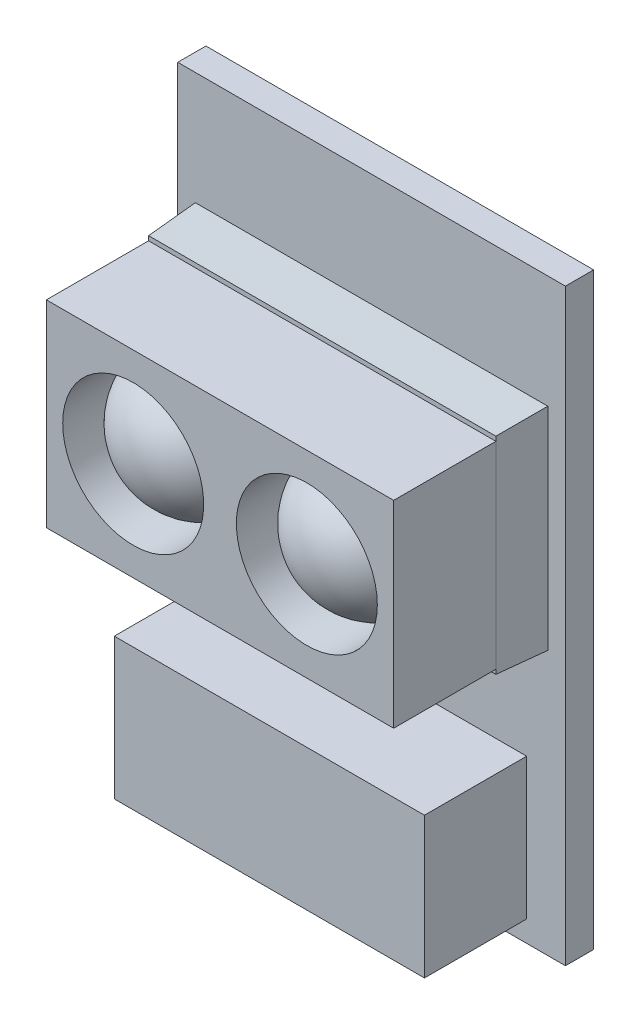
ISO-10303-21;
HEADER;
FILE_DESCRIPTION(('STEP AP214'),'2;1');
FILE_NAME('part.step','',(''),(''),'','','');
FILE_SCHEMA(('AUTOMOTIVE_DESIGN { 1 0 10303 214 1 1 1 1 }'));
ENDSEC;
DATA;
#1=APPLICATION_CONTEXT('core data for automotive mechanical design processes');
#2=APPLICATION_PROTOCOL_DEFINITION('international standard','automotive_design',2000,#1);
#3=PRODUCT_CONTEXT('',#1,'mechanical');
#4=PRODUCT('Part','Part','',(#3));
#5=PRODUCT_RELATED_PRODUCT_CATEGORY('part','',(#4));
#6=PRODUCT_DEFINITION_FORMATION('','',#4);
#7=PRODUCT_DEFINITION_CONTEXT('part definition',#1,'design');
#8=PRODUCT_DEFINITION('design','',#6,#7);
#9=PRODUCT_DEFINITION_SHAPE('','',#8);
#10=(LENGTH_UNIT() NAMED_UNIT(*) SI_UNIT(.MILLI.,.METRE.));
#11=(NAMED_UNIT(*) PLANE_ANGLE_UNIT() SI_UNIT($,.RADIAN.));
#12=(NAMED_UNIT(*) SI_UNIT($,.STERADIAN.) SOLID_ANGLE_UNIT());
#13=UNCERTAINTY_MEASURE_WITH_UNIT(LENGTH_MEASURE(1.E-05),#10,'distance_accuracy_value','');
#14=(GEOMETRIC_REPRESENTATION_CONTEXT(3) GLOBAL_UNCERTAINTY_ASSIGNED_CONTEXT((#13)) GLOBAL_UNIT_ASSIGNED_CONTEXT((#10,
#11,#12)) REPRESENTATION_CONTEXT('',''));
#15=CARTESIAN_POINT('',(0.,0.,0.));
#16=DIRECTION('',(0.,0.,1.));
#17=DIRECTION('',(1.,0.,0.));
#18=AXIS2_PLACEMENT_3D('',#15,#16,#17);
#19=CARTESIAN_POINT('',(4.4,-7.75,3.7));
#20=DIRECTION('',(0.,1.,0.));
#21=DIRECTION('',(0.,0.,1.));
#22=AXIS2_PLACEMENT_3D('',#19,#20,#21);
#23=PLANE('',#22);
#24=DIRECTION('',(1.,0.,0.));
#25=VECTOR('',#24,1.);
#26=CARTESIAN_POINT('',(4.4,-7.75,0.8));
#27=LINE('',#26,#25);
#28=CARTESIAN_POINT('',(-4.4,-7.75,0.8));
#29=VERTEX_POINT('',#28);
#30=CARTESIAN_POINT('',(4.4,-7.75,0.8));
#31=VERTEX_POINT('',#30);
#32=EDGE_CURVE('E169',#29,#31,#27,.T.);
#33=ORIENTED_EDGE('',*,*,#32,.T.);
#34=DIRECTION('',(0.,0.,-1.));
#35=VECTOR('',#34,1.);
#36=CARTESIAN_POINT('',(4.4,-7.75,3.7));
#37=LINE('',#36,#35);
#38=CARTESIAN_POINT('',(4.4,-7.75,3.7));
#39=VERTEX_POINT('',#38);
#40=EDGE_CURVE('E54',#39,#31,#37,.T.);
#41=ORIENTED_EDGE('',*,*,#40,.F.);
#42=DIRECTION('',(1.,0.,0.));
#43=VECTOR('',#42,1.);
#44=CARTESIAN_POINT('',(4.4,-7.75,3.7));
#45=LINE('',#44,#43);
#46=CARTESIAN_POINT('',(-4.4,-7.75,3.7));
#47=VERTEX_POINT('',#46);
#48=EDGE_CURVE('E98',#47,#39,#45,.T.);
#49=ORIENTED_EDGE('',*,*,#48,.F.);
#50=DIRECTION('',(0.,0.,-1.));
#51=VECTOR('',#50,1.);
#52=CARTESIAN_POINT('',(-4.4,-7.75,3.7));
#53=LINE('',#52,#51);
#54=EDGE_CURVE('E12',#47,#29,#53,.T.);
#55=ORIENTED_EDGE('',*,*,#54,.T.);
#56=EDGE_LOOP('',(#33,#41,#49,#55));
#57=FACE_BOUND('',#56,.T.);
#58=DIRECTION('',(1.,0.,0.));
#59=VECTOR('',#58,1.);
#60=CARTESIAN_POINT('',(4.4,-7.75,1.));
#61=LINE('',#60,#59);
#62=CARTESIAN_POINT('',(-4.2,-7.75,1.));
#63=VERTEX_POINT('',#62);
#64=CARTESIAN_POINT('',(4.2,-7.75,1.));
#65=VERTEX_POINT('',#64);
#66=EDGE_CURVE('E142',#63,#65,#61,.T.);
#67=ORIENTED_EDGE('',*,*,#66,.F.);
#68=DIRECTION('',(0.,0.,-1.));
#69=VECTOR('',#68,1.);
#70=CARTESIAN_POINT('',(-4.2,-7.75,3.7));
#71=LINE('',#70,#69);
#72=CARTESIAN_POINT('',(-4.2,-7.75,3.5));
#73=VERTEX_POINT('',#72);
#74=EDGE_CURVE('E141',#73,#63,#71,.T.);
#75=ORIENTED_EDGE('',*,*,#74,.F.);
#76=DIRECTION('',(1.,0.,0.));
#77=VECTOR('',#76,1.);
#78=CARTESIAN_POINT('',(4.4,-7.75,3.5));
#79=LINE('',#78,#77);
#80=CARTESIAN_POINT('',(4.2,-7.75,3.5));
#81=VERTEX_POINT('',#80);
#82=EDGE_CURVE('E146',#73,#81,#79,.T.);
#83=ORIENTED_EDGE('',*,*,#82,.T.);
#84=DIRECTION('',(0.,0.,-1.));
#85=VECTOR('',#84,1.);
#86=CARTESIAN_POINT('',(4.2,-7.75,3.7));
#87=LINE('',#86,#85);
#88=EDGE_CURVE('E151',#81,#65,#87,.T.);
#89=ORIENTED_EDGE('',*,*,#88,.T.);
#90=EDGE_LOOP('',(#67,#75,#83,#89));
#91=FACE_BOUND('',#90,.T.);
#92=ADVANCED_FACE('F46',(#57,#91),#23,.F.);
#93=CARTESIAN_POINT('',(-4.4,-7.75,3.7));
#94=DIRECTION('',(1.,0.,0.));
#95=DIRECTION('',(0.,1.,0.));
#96=AXIS2_PLACEMENT_3D('',#93,#94,#95);
#97=PLANE('',#96);
#98=DIRECTION('',(0.,-1.,0.));
#99=VECTOR('',#98,1.);
#100=CARTESIAN_POINT('',(-4.4,-7.75,0.8));
#101=LINE('',#100,#99);
#102=CARTESIAN_POINT('',(-4.4,-3.75,0.8));
#103=VERTEX_POINT('',#102);
#104=EDGE_CURVE('E154',#103,#29,#101,.T.);
#105=ORIENTED_EDGE('',*,*,#104,.T.);
#106=ORIENTED_EDGE('',*,*,#54,.F.);
#107=DIRECTION('',(0.,-1.,0.));
#108=VECTOR('',#107,1.);
#109=CARTESIAN_POINT('',(-4.4,-7.75,3.7));
#110=LINE('',#109,#108);
#111=CARTESIAN_POINT('',(-4.4,-3.75,3.7));
#112=VERTEX_POINT('',#111);
#113=EDGE_CURVE('E160',#112,#47,#110,.T.);
#114=ORIENTED_EDGE('',*,*,#113,.F.);
#115=DIRECTION('',(0.,0.,-1.));
#116=VECTOR('',#115,1.);
#117=CARTESIAN_POINT('',(-4.4,-3.75,3.7));
#118=LINE('',#117,#116);
#119=EDGE_CURVE('E166',#112,#103,#118,.T.);
#120=ORIENTED_EDGE('',*,*,#119,.T.);
#121=EDGE_LOOP('',(#105,#106,#114,#120));
#122=FACE_BOUND('',#121,.T.);
#123=ADVANCED_FACE('F48',(#122),#97,.F.);
#124=CARTESIAN_POINT('',(4.4,-7.75,3.7));
#125=DIRECTION('',(-1.,0.,0.));
#126=DIRECTION('',(0.,0.,1.));
#127=AXIS2_PLACEMENT_3D('',#124,#125,#126);
#128=PLANE('',#127);
#129=DIRECTION('',(0.,1.,0.));
#130=VECTOR('',#129,1.);
#131=CARTESIAN_POINT('',(4.4,-7.75,0.8));
#132=LINE('',#131,#130);
#133=CARTESIAN_POINT('',(4.4,-3.75,0.8));
#134=VERTEX_POINT('',#133);
#135=EDGE_CURVE('E171',#31,#134,#132,.T.);
#136=ORIENTED_EDGE('',*,*,#135,.T.);
#137=DIRECTION('',(0.,0.,-1.));
#138=VECTOR('',#137,1.);
#139=CARTESIAN_POINT('',(4.4,-3.75,3.7));
#140=LINE('',#139,#138);
#141=CARTESIAN_POINT('',(4.4,-3.75,3.7));
#142=VERTEX_POINT('',#141);
#143=EDGE_CURVE('E175',#142,#134,#140,.T.);
#144=ORIENTED_EDGE('',*,*,#143,.F.);
#145=DIRECTION('',(0.,1.,0.));
#146=VECTOR('',#145,1.);
#147=CARTESIAN_POINT('',(4.4,-7.75,3.7));
#148=LINE('',#147,#146);
#149=EDGE_CURVE('E163',#39,#142,#148,.T.);
#150=ORIENTED_EDGE('',*,*,#149,.F.);
#151=ORIENTED_EDGE('',*,*,#40,.T.);
#152=EDGE_LOOP('',(#136,#144,#150,#151));
#153=FACE_BOUND('',#152,.T.);
#154=ADVANCED_FACE('F180',(#153),#128,.F.);
#155=CARTESIAN_POINT('',(4.4,-3.75,3.7));
#156=DIRECTION('',(0.,-1.,0.));
#157=DIRECTION('',(0.,0.,-1.));
#158=AXIS2_PLACEMENT_3D('',#155,#156,#157);
#159=PLANE('',#158);
#160=DIRECTION('',(-1.,0.,0.));
#161=VECTOR('',#160,1.);
#162=CARTESIAN_POINT('',(4.4,-3.75,0.8));
#163=LINE('',#162,#161);
#164=EDGE_CURVE('E91',#134,#103,#163,.T.);
#165=ORIENTED_EDGE('',*,*,#164,.T.);
#166=ORIENTED_EDGE('',*,*,#119,.F.);
#167=DIRECTION('',(-1.,0.,0.));
#168=VECTOR('',#167,1.);
#169=CARTESIAN_POINT('',(4.4,-3.75,3.7));
#170=LINE('',#169,#168);
#171=EDGE_CURVE('E70',#142,#112,#170,.T.);
#172=ORIENTED_EDGE('',*,*,#171,.F.);
#173=ORIENTED_EDGE('',*,*,#143,.T.);
#174=EDGE_LOOP('',(#165,#166,#172,#173));
#175=FACE_BOUND('',#174,.T.);
#176=ADVANCED_FACE('F188',(#175),#159,.F.);
#177=CARTESIAN_POINT('',(0.,0.,3.7));
#178=DIRECTION('',(0.,0.,1.));
#179=DIRECTION('',(1.,0.,0.));
#180=AXIS2_PLACEMENT_3D('',#177,#178,#179);
#181=PLANE('',#180);
#182=ORIENTED_EDGE('',*,*,#113,.T.);
#183=ORIENTED_EDGE('',*,*,#48,.T.);
#184=ORIENTED_EDGE('',*,*,#149,.T.);
#185=ORIENTED_EDGE('',*,*,#171,.T.);
#186=EDGE_LOOP('',(#182,#183,#184,#185));
#187=FACE_BOUND('',#186,.T.);
#188=ADVANCED_FACE('F190',(#187),#181,.T.);
#189=CARTESIAN_POINT('',(0.,0.,0.8));
#190=DIRECTION('',(0.,0.,1.));
#191=DIRECTION('',(1.,0.,0.));
#192=AXIS2_PLACEMENT_3D('',#189,#190,#191);
#193=PLANE('',#192);
#194=ORIENTED_EDGE('',*,*,#104,.F.);
#195=ORIENTED_EDGE('',*,*,#164,.F.);
#196=ORIENTED_EDGE('',*,*,#135,.F.);
#197=ORIENTED_EDGE('',*,*,#32,.F.);
#198=EDGE_LOOP('',(#194,#195,#196,#197));
#199=FACE_BOUND('',#198,.T.);
#200=ADVANCED_FACE('F184',(#199),#193,.F.);
#201=CARTESIAN_POINT('',(-4.2,-7.75,3.7));
#202=DIRECTION('',(1.,0.,0.));
#203=DIRECTION('',(0.,1.,0.));
#204=AXIS2_PLACEMENT_3D('',#201,#202,#203);
#205=PLANE('',#204);
#206=DIRECTION('',(0.,-1.,0.));
#207=VECTOR('',#206,1.);
#208=CARTESIAN_POINT('',(-4.2,-7.75,1.));
#209=LINE('',#208,#207);
#210=CARTESIAN_POINT('',(-4.2,-3.95,1.));
#211=VERTEX_POINT('',#210);
#212=EDGE_CURVE('E125',#211,#63,#209,.T.);
#213=ORIENTED_EDGE('',*,*,#212,.F.);
#214=DIRECTION('',(0.,0.,-1.));
#215=VECTOR('',#214,1.);
#216=CARTESIAN_POINT('',(-4.2,-3.95,3.7));
#217=LINE('',#216,#215);
#218=CARTESIAN_POINT('',(-4.2,-3.95,3.5));
#219=VERTEX_POINT('',#218);
#220=EDGE_CURVE('E133',#219,#211,#217,.T.);
#221=ORIENTED_EDGE('',*,*,#220,.F.);
#222=DIRECTION('',(0.,-1.,0.));
#223=VECTOR('',#222,1.);
#224=CARTESIAN_POINT('',(-4.2,-7.75,3.5));
#225=LINE('',#224,#223);
#226=EDGE_CURVE('E61',#219,#73,#225,.T.);
#227=ORIENTED_EDGE('',*,*,#226,.T.);
#228=ORIENTED_EDGE('',*,*,#74,.T.);
#229=EDGE_LOOP('',(#213,#221,#227,#228));
#230=FACE_BOUND('',#229,.T.);
#231=ADVANCED_FACE('F139',(#230),#205,.T.);
#232=CARTESIAN_POINT('',(4.2,-7.75,3.7));
#233=DIRECTION('',(-1.,0.,0.));
#234=DIRECTION('',(0.,0.,1.));
#235=AXIS2_PLACEMENT_3D('',#232,#233,#234);
#236=PLANE('',#235);
#237=DIRECTION('',(0.,1.,0.));
#238=VECTOR('',#237,1.);
#239=CARTESIAN_POINT('',(4.2,-7.75,1.));
#240=LINE('',#239,#238);
#241=CARTESIAN_POINT('',(4.2,-3.95,1.));
#242=VERTEX_POINT('',#241);
#243=EDGE_CURVE('E128',#65,#242,#240,.T.);
#244=ORIENTED_EDGE('',*,*,#243,.F.);
#245=ORIENTED_EDGE('',*,*,#88,.F.);
#246=DIRECTION('',(0.,1.,0.));
#247=VECTOR('',#246,1.);
#248=CARTESIAN_POINT('',(4.2,-7.75,3.5));
#249=LINE('',#248,#247);
#250=CARTESIAN_POINT('',(4.2,-3.95,3.5));
#251=VERTEX_POINT('',#250);
#252=EDGE_CURVE('E149',#81,#251,#249,.T.);
#253=ORIENTED_EDGE('',*,*,#252,.T.);
#254=DIRECTION('',(0.,0.,-1.));
#255=VECTOR('',#254,1.);
#256=CARTESIAN_POINT('',(4.2,-3.95,3.7));
#257=LINE('',#256,#255);
#258=EDGE_CURVE('E137',#251,#242,#257,.T.);
#259=ORIENTED_EDGE('',*,*,#258,.T.);
#260=EDGE_LOOP('',(#244,#245,#253,#259));
#261=FACE_BOUND('',#260,.T.);
#262=ADVANCED_FACE('F205',(#261),#236,.T.);
#263=CARTESIAN_POINT('',(4.4,-3.95,3.7));
#264=DIRECTION('',(0.,-1.,0.));
#265=DIRECTION('',(0.,0.,-1.));
#266=AXIS2_PLACEMENT_3D('',#263,#264,#265);
#267=PLANE('',#266);
#268=DIRECTION('',(-1.,0.,0.));
#269=VECTOR('',#268,1.);
#270=CARTESIAN_POINT('',(4.4,-3.95,1.));
#271=LINE('',#270,#269);
#272=EDGE_CURVE('E121',#242,#211,#271,.T.);
#273=ORIENTED_EDGE('',*,*,#272,.F.);
#274=ORIENTED_EDGE('',*,*,#258,.F.);
#275=DIRECTION('',(-1.,0.,0.));
#276=VECTOR('',#275,1.);
#277=CARTESIAN_POINT('',(4.4,-3.95,3.5));
#278=LINE('',#277,#276);
#279=EDGE_CURVE('E136',#251,#219,#278,.T.);
#280=ORIENTED_EDGE('',*,*,#279,.T.);
#281=ORIENTED_EDGE('',*,*,#220,.T.);
#282=EDGE_LOOP('',(#273,#274,#280,#281));
#283=FACE_BOUND('',#282,.T.);
#284=ADVANCED_FACE('F134',(#283),#267,.T.);
#285=CARTESIAN_POINT('',(0.,0.,3.5));
#286=DIRECTION('',(0.,0.,1.));
#287=DIRECTION('',(1.,0.,0.));
#288=AXIS2_PLACEMENT_3D('',#285,#286,#287);
#289=PLANE('',#288);
#290=ORIENTED_EDGE('',*,*,#226,.F.);
#291=ORIENTED_EDGE('',*,*,#279,.F.);
#292=ORIENTED_EDGE('',*,*,#252,.F.);
#293=ORIENTED_EDGE('',*,*,#82,.F.);
#294=EDGE_LOOP('',(#290,#291,#292,#293));
#295=FACE_BOUND('',#294,.T.);
#296=ADVANCED_FACE('F208',(#295),#289,.F.);
#297=CARTESIAN_POINT('',(0.,0.,1.));
#298=DIRECTION('',(0.,0.,1.));
#299=DIRECTION('',(1.,0.,0.));
#300=AXIS2_PLACEMENT_3D('',#297,#298,#299);
#301=PLANE('',#300);
#302=ORIENTED_EDGE('',*,*,#212,.T.);
#303=ORIENTED_EDGE('',*,*,#66,.T.);
#304=ORIENTED_EDGE('',*,*,#243,.T.);
#305=ORIENTED_EDGE('',*,*,#272,.T.);
#306=EDGE_LOOP('',(#302,#303,#304,#305));
#307=FACE_BOUND('',#306,.T.);
#308=ADVANCED_FACE('F123',(#307),#301,.T.);
#309=CLOSED_SHELL('',(#92,#123,#154,#176,#188,#200,#231,#262,#284,#296,#308));
#310=MANIFOLD_SOLID_BREP('B2',#309);
#311=CARTESIAN_POINT('',(0.,0.,5.1));
#312=DIRECTION('',(0.,0.,-1.));
#313=DIRECTION('',(-1.,0.,0.));
#314=AXIS2_PLACEMENT_3D('',#311,#312,#313);
#315=PLANE('',#314);
#316=CARTESIAN_POINT('',(2.46331455450187,2.15,5.1));
#317=DIRECTION('',(0.,0.,1.));
#318=DIRECTION('',(1.,0.,0.));
#319=AXIS2_PLACEMENT_3D('',#316,#317,#318);
#320=CIRCLE('',#319,2.);
#321=CARTESIAN_POINT('',(4.46331455450187,2.15,5.1));
#322=VERTEX_POINT('',#321);
#323=EDGE_CURVE('E464',#322,#322,#320,.T.);
#324=ORIENTED_EDGE('',*,*,#323,.F.);
#325=EDGE_LOOP('',(#324));
#326=FACE_BOUND('',#325,.T.);
#327=DIRECTION('',(0.,1.,0.));
#328=VECTOR('',#327,1.);
#329=CARTESIAN_POINT('',(4.92662910900374,-0.65,5.1));
#330=LINE('',#329,#328);
#331=CARTESIAN_POINT('',(4.92662910900374,-0.65,5.1));
#332=VERTEX_POINT('',#331);
#333=CARTESIAN_POINT('',(4.92662910900374,4.95,5.1));
#334=VERTEX_POINT('',#333);
#335=EDGE_CURVE('E386',#332,#334,#330,.T.);
#336=ORIENTED_EDGE('',*,*,#335,.T.);
#337=DIRECTION('',(-1.,0.,0.));
#338=VECTOR('',#337,1.);
#339=CARTESIAN_POINT('',(-4.92662910900374,4.95,5.1));
#340=LINE('',#339,#338);
#341=CARTESIAN_POINT('',(-4.92662910900374,4.95,5.1));
#342=VERTEX_POINT('',#341);
#343=EDGE_CURVE('E376',#334,#342,#340,.T.);
#344=ORIENTED_EDGE('',*,*,#343,.T.);
#345=DIRECTION('',(0.,-1.,0.));
#346=VECTOR('',#345,1.);
#347=CARTESIAN_POINT('',(-4.92662910900374,-0.65,5.1));
#348=LINE('',#347,#346);
#349=CARTESIAN_POINT('',(-4.92662910900374,-0.65,5.1));
#350=VERTEX_POINT('',#349);
#351=EDGE_CURVE('E385',#342,#350,#348,.T.);
#352=ORIENTED_EDGE('',*,*,#351,.T.);
#353=DIRECTION('',(1.,0.,0.));
#354=VECTOR('',#353,1.);
#355=CARTESIAN_POINT('',(-4.92662910900374,-0.65,5.1));
#356=LINE('',#355,#354);
#357=EDGE_CURVE('E391',#350,#332,#356,.T.);
#358=ORIENTED_EDGE('',*,*,#357,.T.);
#359=EDGE_LOOP('',(#336,#344,#352,#358));
#360=FACE_BOUND('',#359,.T.);
#361=CARTESIAN_POINT('',(-2.46331455450187,2.15,5.1));
#362=DIRECTION('',(0.,0.,-1.));
#363=DIRECTION('',(-1.,0.,0.));
#364=AXIS2_PLACEMENT_3D('',#361,#362,#363);
#365=CIRCLE('',#364,2.);
#366=CARTESIAN_POINT('',(-4.46331455450187,2.15,5.1));
#367=VERTEX_POINT('',#366);
#368=EDGE_CURVE('E468',#367,#367,#365,.T.);
#369=ORIENTED_EDGE('',*,*,#368,.T.);
#370=EDGE_LOOP('',(#369));
#371=FACE_BOUND('',#370,.T.);
#372=ADVANCED_FACE('F284',(#326,#360,#371),#315,.F.);
#373=CARTESIAN_POINT('',(0.,0.,2.2));
#374=DIRECTION('',(0.,0.,1.));
#375=DIRECTION('',(1.,0.,0.));
#376=AXIS2_PLACEMENT_3D('',#373,#374,#375);
#377=PLANE('',#376);
#378=DIRECTION('',(1.,0.,0.));
#379=VECTOR('',#378,1.);
#380=CARTESIAN_POINT('',(-4.92662910900374,-0.65,2.2));
#381=LINE('',#380,#379);
#382=CARTESIAN_POINT('',(-4.92662910900374,-0.65,2.2));
#383=VERTEX_POINT('',#382);
#384=CARTESIAN_POINT('',(4.92662910900374,-0.65,2.2));
#385=VERTEX_POINT('',#384);
#386=EDGE_CURVE('E395',#383,#385,#381,.T.);
#387=ORIENTED_EDGE('',*,*,#386,.F.);
#388=DIRECTION('',(0.,1.,0.));
#389=VECTOR('',#388,1.);
#390=CARTESIAN_POINT('',(-4.92662910900374,-0.850000000000001,2.2));
#391=LINE('',#390,#389);
#392=CARTESIAN_POINT('',(-4.92662910900374,-0.776629109003743,2.2));
#393=VERTEX_POINT('',#392);
#394=EDGE_CURVE('E415',#383,#393,#391,.F.);
#395=ORIENTED_EDGE('',*,*,#394,.T.);
#396=DIRECTION('',(-1.,0.,0.));
#397=VECTOR('',#396,1.);
#398=CARTESIAN_POINT('',(5.,-0.776629109003742,2.2));
#399=LINE('',#398,#397);
#400=CARTESIAN_POINT('',(4.92662910900374,-0.776629109003742,2.2));
#401=VERTEX_POINT('',#400);
#402=EDGE_CURVE('E432',#393,#401,#399,.F.);
#403=ORIENTED_EDGE('',*,*,#402,.T.);
#404=DIRECTION('',(0.,-1.,0.));
#405=VECTOR('',#404,1.);
#406=CARTESIAN_POINT('',(4.92662910900374,-0.85,2.2));
#407=LINE('',#406,#405);
#408=EDGE_CURVE('E435',#401,#385,#407,.F.);
#409=ORIENTED_EDGE('',*,*,#408,.T.);
#410=EDGE_LOOP('',(#387,#395,#403,#409));
#411=FACE_BOUND('',#410,.T.);
#412=ADVANCED_FACE('F499',(#411),#377,.T.);
#413=CARTESIAN_POINT('',(0.,0.,0.8));
#414=DIRECTION('',(0.,0.,-1.));
#415=DIRECTION('',(-1.,0.,0.));
#416=AXIS2_PLACEMENT_3D('',#413,#414,#415);
#417=PLANE('',#416);
#418=DIRECTION('',(0.,1.,0.));
#419=VECTOR('',#418,1.);
#420=CARTESIAN_POINT('',(5.5,-8.35,0.8));
#421=LINE('',#420,#419);
#422=CARTESIAN_POINT('',(5.5,-8.35,0.8));
#423=VERTEX_POINT('',#422);
#424=CARTESIAN_POINT('',(5.5,8.35,0.8));
#425=VERTEX_POINT('',#424);
#426=EDGE_CURVE('E438',#423,#425,#421,.T.);
#427=ORIENTED_EDGE('',*,*,#426,.T.);
#428=DIRECTION('',(-1.,0.,0.));
#429=VECTOR('',#428,1.);
#430=CARTESIAN_POINT('',(-5.5,8.35,0.8));
#431=LINE('',#430,#429);
#432=CARTESIAN_POINT('',(-5.5,8.35,0.8));
#433=VERTEX_POINT('',#432);
#434=EDGE_CURVE('E441',#425,#433,#431,.T.);
#435=ORIENTED_EDGE('',*,*,#434,.T.);
#436=DIRECTION('',(0.,-1.,0.));
#437=VECTOR('',#436,1.);
#438=CARTESIAN_POINT('',(-5.5,-8.35,0.8));
#439=LINE('',#438,#437);
#440=CARTESIAN_POINT('',(-5.5,-8.35,0.8));
#441=VERTEX_POINT('',#440);
#442=EDGE_CURVE('E444',#433,#441,#439,.T.);
#443=ORIENTED_EDGE('',*,*,#442,.T.);
#444=DIRECTION('',(1.,0.,0.));
#445=VECTOR('',#444,1.);
#446=CARTESIAN_POINT('',(-5.5,-8.35,0.8));
#447=LINE('',#446,#445);
#448=EDGE_CURVE('E446',#441,#423,#447,.T.);
#449=ORIENTED_EDGE('',*,*,#448,.T.);
#450=EDGE_LOOP('',(#427,#435,#443,#449));
#451=FACE_BOUND('',#450,.T.);
#452=DIRECTION('',(0.,-1.,0.));
#453=VECTOR('',#452,1.);
#454=CARTESIAN_POINT('',(-5.,-0.850000000000001,0.8));
#455=LINE('',#454,#453);
#456=CARTESIAN_POINT('',(-5.,5.15,0.8));
#457=VERTEX_POINT('',#456);
#458=CARTESIAN_POINT('',(-5.,-0.850000000000001,0.8));
#459=VERTEX_POINT('',#458);
#460=EDGE_CURVE('E398',#457,#459,#455,.T.);
#461=ORIENTED_EDGE('',*,*,#460,.F.);
#462=DIRECTION('',(-1.,0.,0.));
#463=VECTOR('',#462,1.);
#464=CARTESIAN_POINT('',(5.,5.15,0.8));
#465=LINE('',#464,#463);
#466=CARTESIAN_POINT('',(5.,5.15,0.8));
#467=VERTEX_POINT('',#466);
#468=EDGE_CURVE('E412',#467,#457,#465,.T.);
#469=ORIENTED_EDGE('',*,*,#468,.F.);
#470=DIRECTION('',(0.,1.,0.));
#471=VECTOR('',#470,1.);
#472=CARTESIAN_POINT('',(5.,-0.85,0.8));
#473=LINE('',#472,#471);
#474=CARTESIAN_POINT('',(5.,-0.85,0.8));
#475=VERTEX_POINT('',#474);
#476=EDGE_CURVE('E409',#475,#467,#473,.T.);
#477=ORIENTED_EDGE('',*,*,#476,.F.);
#478=DIRECTION('',(1.,0.,0.));
#479=VECTOR('',#478,1.);
#480=CARTESIAN_POINT('',(5.,-0.85,0.8));
#481=LINE('',#480,#479);
#482=EDGE_CURVE('E401',#459,#475,#481,.T.);
#483=ORIENTED_EDGE('',*,*,#482,.F.);
#484=EDGE_LOOP('',(#461,#469,#477,#483));
#485=FACE_BOUND('',#484,.T.);
#486=ADVANCED_FACE('F522',(#451,#485),#417,.F.);
#487=CARTESIAN_POINT('',(5.5,-8.35,0.8));
#488=DIRECTION('',(-1.,0.,0.));
#489=DIRECTION('',(0.,0.,1.));
#490=AXIS2_PLACEMENT_3D('',#487,#488,#489);
#491=PLANE('',#490);
#492=DIRECTION('',(0.,1.,0.));
#493=VECTOR('',#492,1.);
#494=CARTESIAN_POINT('',(5.5,-8.35,0.));
#495=LINE('',#494,#493);
#496=CARTESIAN_POINT('',(5.5,-8.35,0.));
#497=VERTEX_POINT('',#496);
#498=CARTESIAN_POINT('',(5.5,8.35,0.));
#499=VERTEX_POINT('',#498);
#500=EDGE_CURVE('E419',#497,#499,#495,.T.);
#501=ORIENTED_EDGE('',*,*,#500,.T.);
#502=DIRECTION('',(0.,0.,-1.));
#503=VECTOR('',#502,1.);
#504=CARTESIAN_POINT('',(5.5,8.35,0.8));
#505=LINE('',#504,#503);
#506=EDGE_CURVE('E44',#425,#499,#505,.T.);
#507=ORIENTED_EDGE('',*,*,#506,.F.);
#508=ORIENTED_EDGE('',*,*,#426,.F.);
#509=DIRECTION('',(0.,0.,-1.));
#510=VECTOR('',#509,1.);
#511=CARTESIAN_POINT('',(5.5,-8.35,0.8));
#512=LINE('',#511,#510);
#513=EDGE_CURVE('E448',#423,#497,#512,.T.);
#514=ORIENTED_EDGE('',*,*,#513,.T.);
#515=EDGE_LOOP('',(#501,#507,#508,#514));
#516=FACE_BOUND('',#515,.T.);
#517=ADVANCED_FACE('F560',(#516),#491,.F.);
#518=CARTESIAN_POINT('',(-5.5,8.35,0.8));
#519=DIRECTION('',(0.,-1.,0.));
#520=DIRECTION('',(0.,0.,-1.));
#521=AXIS2_PLACEMENT_3D('',#518,#519,#520);
#522=PLANE('',#521);
#523=DIRECTION('',(-1.,0.,0.));
#524=VECTOR('',#523,1.);
#525=CARTESIAN_POINT('',(-5.5,8.35,0.));
#526=LINE('',#525,#524);
#527=CARTESIAN_POINT('',(-5.5,8.35,0.));
#528=VERTEX_POINT('',#527);
#529=EDGE_CURVE('E451',#499,#528,#526,.T.);
#530=ORIENTED_EDGE('',*,*,#529,.T.);
#531=DIRECTION('',(0.,0.,-1.));
#532=VECTOR('',#531,1.);
#533=CARTESIAN_POINT('',(-5.5,8.35,0.8));
#534=LINE('',#533,#532);
#535=EDGE_CURVE('E293',#433,#528,#534,.T.);
#536=ORIENTED_EDGE('',*,*,#535,.F.);
#537=ORIENTED_EDGE('',*,*,#434,.F.);
#538=ORIENTED_EDGE('',*,*,#506,.T.);
#539=EDGE_LOOP('',(#530,#536,#537,#538));
#540=FACE_BOUND('',#539,.T.);
#541=ADVANCED_FACE('F556',(#540),#522,.F.);
#542=CARTESIAN_POINT('',(-5.5,-8.35,0.8));
#543=DIRECTION('',(1.,0.,0.));
#544=DIRECTION('',(0.,0.,-1.));
#545=AXIS2_PLACEMENT_3D('',#542,#543,#544);
#546=PLANE('',#545);
#547=DIRECTION('',(0.,-1.,0.));
#548=VECTOR('',#547,1.);
#549=CARTESIAN_POINT('',(-5.5,-8.35,0.));
#550=LINE('',#549,#548);
#551=CARTESIAN_POINT('',(-5.5,-8.35,0.));
#552=VERTEX_POINT('',#551);
#553=EDGE_CURVE('E453',#528,#552,#550,.T.);
#554=ORIENTED_EDGE('',*,*,#553,.T.);
#555=DIRECTION('',(0.,0.,-1.));
#556=VECTOR('',#555,1.);
#557=CARTESIAN_POINT('',(-5.5,-8.35,0.8));
#558=LINE('',#557,#556);
#559=EDGE_CURVE('E458',#441,#552,#558,.T.);
#560=ORIENTED_EDGE('',*,*,#559,.F.);
#561=ORIENTED_EDGE('',*,*,#442,.F.);
#562=ORIENTED_EDGE('',*,*,#535,.T.);
#563=EDGE_LOOP('',(#554,#560,#561,#562));
#564=FACE_BOUND('',#563,.T.);
#565=ADVANCED_FACE('F548',(#564),#546,.F.);
#566=CARTESIAN_POINT('',(-5.5,-8.35,0.8));
#567=DIRECTION('',(0.,1.,0.));
#568=DIRECTION('',(0.,0.,1.));
#569=AXIS2_PLACEMENT_3D('',#566,#567,#568);
#570=PLANE('',#569);
#571=DIRECTION('',(1.,0.,0.));
#572=VECTOR('',#571,1.);
#573=CARTESIAN_POINT('',(-5.5,-8.35,0.));
#574=LINE('',#573,#572);
#575=EDGE_CURVE('E442',#552,#497,#574,.T.);
#576=ORIENTED_EDGE('',*,*,#575,.T.);
#577=ORIENTED_EDGE('',*,*,#513,.F.);
#578=ORIENTED_EDGE('',*,*,#448,.F.);
#579=ORIENTED_EDGE('',*,*,#559,.T.);
#580=EDGE_LOOP('',(#576,#577,#578,#579));
#581=FACE_BOUND('',#580,.T.);
#582=ADVANCED_FACE('F542',(#581),#570,.F.);
#583=CARTESIAN_POINT('',(0.,0.,0.));
#584=DIRECTION('',(0.,0.,-1.));
#585=DIRECTION('',(-1.,0.,0.));
#586=AXIS2_PLACEMENT_3D('',#583,#584,#585);
#587=PLANE('',#586);
#588=ORIENTED_EDGE('',*,*,#500,.F.);
#589=ORIENTED_EDGE('',*,*,#575,.F.);
#590=ORIENTED_EDGE('',*,*,#553,.F.);
#591=ORIENTED_EDGE('',*,*,#529,.F.);
#592=EDGE_LOOP('',(#588,#589,#590,#591));
#593=FACE_BOUND('',#592,.T.);
#594=ADVANCED_FACE('F538',(#593),#587,.T.);
#595=CARTESIAN_POINT('',(-5.,-0.850000000000001,0.8));
#596=DIRECTION('',(-0.998629534754574,0.,0.0523359562429439));
#597=DIRECTION('',(0.052335956242944,0.,0.998629534754574));
#598=AXIS2_PLACEMENT_3D('',#595,#596,#597);
#599=PLANE('',#598);
#600=ORIENTED_EDGE('',*,*,#460,.T.);
#601=DIRECTION('',(-0.052264427688714,-0.052264427688714,-0.997264688634237));
#602=VECTOR('',#601,1.);
#603=CARTESIAN_POINT('',(-4.97268429598371,-0.822684295983713,1.32121468205632));
#604=LINE('',#603,#602);
#605=EDGE_CURVE('E416',#393,#459,#604,.T.);
#606=ORIENTED_EDGE('',*,*,#605,.F.);
#607=ORIENTED_EDGE('',*,*,#394,.F.);
#608=DIRECTION('',(0.,-1.,0.));
#609=VECTOR('',#608,1.);
#610=CARTESIAN_POINT('',(-4.92662910900374,-0.65,2.2));
#611=LINE('',#610,#609);
#612=CARTESIAN_POINT('',(-4.92662910900374,4.95,2.2));
#613=VERTEX_POINT('',#612);
#614=EDGE_CURVE('E480',#613,#383,#611,.T.);
#615=ORIENTED_EDGE('',*,*,#614,.F.);
#616=CARTESIAN_POINT('',(-4.92662910900374,5.07662910900374,2.2));
#617=VERTEX_POINT('',#616);
#618=EDGE_CURVE('E430',#617,#613,#391,.F.);
#619=ORIENTED_EDGE('',*,*,#618,.F.);
#620=DIRECTION('',(-0.052264427688714,0.052264427688714,-0.997264688634237));
#621=VECTOR('',#620,1.);
#622=CARTESIAN_POINT('',(-4.98361057759023,5.13361057759023,1.11272880923379));
#623=LINE('',#622,#621);
#624=EDGE_CURVE('E421',#617,#457,#623,.T.);
#625=ORIENTED_EDGE('',*,*,#624,.T.);
#626=EDGE_LOOP('',(#600,#606,#607,#615,#619,#625));
#627=FACE_BOUND('',#626,.T.);
#628=ADVANCED_FACE('F495',(#627),#599,.T.);
#629=CARTESIAN_POINT('',(5.,-0.85,0.8));
#630=DIRECTION('',(0.,-0.998629534754574,0.0523359562429439));
#631=DIRECTION('',(0.,-0.052335956242944,-0.998629534754574));
#632=AXIS2_PLACEMENT_3D('',#629,#630,#631);
#633=PLANE('',#632);
#634=ORIENTED_EDGE('',*,*,#482,.T.);
#635=DIRECTION('',(0.052264427688714,-0.052264427688714,-0.997264688634237));
#636=VECTOR('',#635,1.);
#637=CARTESIAN_POINT('',(5.,-0.85,0.8));
#638=LINE('',#637,#636);
#639=EDGE_CURVE('E420',#401,#475,#638,.T.);
#640=ORIENTED_EDGE('',*,*,#639,.F.);
#641=ORIENTED_EDGE('',*,*,#402,.F.);
#642=ORIENTED_EDGE('',*,*,#605,.T.);
#643=EDGE_LOOP('',(#634,#640,#641,#642));
#644=FACE_BOUND('',#643,.T.);
#645=ADVANCED_FACE('F502',(#644),#633,.T.);
#646=CARTESIAN_POINT('',(5.,-0.85,0.8));
#647=DIRECTION('',(0.998629534754574,0.,0.0523359562429439));
#648=DIRECTION('',(0.052335956242944,0.,-0.998629534754574));
#649=AXIS2_PLACEMENT_3D('',#646,#647,#648);
#650=PLANE('',#649);
#651=ORIENTED_EDGE('',*,*,#476,.T.);
#652=DIRECTION('',(0.052264427688714,0.052264427688714,-0.997264688634237));
#653=VECTOR('',#652,1.);
#654=CARTESIAN_POINT('',(5.,5.15,0.8));
#655=LINE('',#654,#653);
#656=CARTESIAN_POINT('',(4.92662910900374,5.07662910900374,2.2));
#657=VERTEX_POINT('',#656);
#658=EDGE_CURVE('E424',#657,#467,#655,.T.);
#659=ORIENTED_EDGE('',*,*,#658,.F.);
#660=CARTESIAN_POINT('',(4.92662910900374,4.95,2.2));
#661=VERTEX_POINT('',#660);
#662=EDGE_CURVE('E434',#661,#657,#407,.F.);
#663=ORIENTED_EDGE('',*,*,#662,.F.);
#664=DIRECTION('',(0.,1.,0.));
#665=VECTOR('',#664,1.);
#666=CARTESIAN_POINT('',(4.92662910900374,-0.65,2.2));
#667=LINE('',#666,#665);
#668=EDGE_CURVE('E308',#385,#661,#667,.T.);
#669=ORIENTED_EDGE('',*,*,#668,.F.);
#670=ORIENTED_EDGE('',*,*,#408,.F.);
#671=ORIENTED_EDGE('',*,*,#639,.T.);
#672=EDGE_LOOP('',(#651,#659,#663,#669,#670,#671));
#673=FACE_BOUND('',#672,.T.);
#674=ADVANCED_FACE('F503',(#673),#650,.T.);
#675=CARTESIAN_POINT('',(5.,5.15,0.8));
#676=DIRECTION('',(0.,0.998629534754574,0.0523359562429439));
#677=DIRECTION('',(0.,-0.052335956242944,0.998629534754574));
#678=AXIS2_PLACEMENT_3D('',#675,#676,#677);
#679=PLANE('',#678);
#680=ORIENTED_EDGE('',*,*,#468,.T.);
#681=ORIENTED_EDGE('',*,*,#624,.F.);
#682=DIRECTION('',(1.,0.,0.));
#683=VECTOR('',#682,1.);
#684=CARTESIAN_POINT('',(5.,5.07662910900374,2.2));
#685=LINE('',#684,#683);
#686=EDGE_CURVE('E425',#657,#617,#685,.F.);
#687=ORIENTED_EDGE('',*,*,#686,.F.);
#688=ORIENTED_EDGE('',*,*,#658,.T.);
#689=EDGE_LOOP('',(#680,#681,#687,#688));
#690=FACE_BOUND('',#689,.T.);
#691=ADVANCED_FACE('F506',(#690),#679,.T.);
#692=DIRECTION('',(-1.,0.,0.));
#693=VECTOR('',#692,1.);
#694=CARTESIAN_POINT('',(-4.92662910900374,4.95,2.2));
#695=LINE('',#694,#693);
#696=EDGE_CURVE('E301',#661,#613,#695,.T.);
#697=ORIENTED_EDGE('',*,*,#696,.F.);
#698=ORIENTED_EDGE('',*,*,#662,.T.);
#699=ORIENTED_EDGE('',*,*,#686,.T.);
#700=ORIENTED_EDGE('',*,*,#618,.T.);
#701=EDGE_LOOP('',(#697,#698,#699,#700));
#702=FACE_BOUND('',#701,.T.);
#703=ADVANCED_FACE('F512',(#702),#377,.T.);
#704=CARTESIAN_POINT('',(4.92662910900374,-0.65,5.1));
#705=DIRECTION('',(-1.,0.,0.));
#706=DIRECTION('',(0.,0.,1.));
#707=AXIS2_PLACEMENT_3D('',#704,#705,#706);
#708=PLANE('',#707);
#709=ORIENTED_EDGE('',*,*,#668,.T.);
#710=DIRECTION('',(0.,0.,-1.));
#711=VECTOR('',#710,1.);
#712=CARTESIAN_POINT('',(4.92662910900374,4.95,5.1));
#713=LINE('',#712,#711);
#714=EDGE_CURVE('E380',#334,#661,#713,.T.);
#715=ORIENTED_EDGE('',*,*,#714,.F.);
#716=ORIENTED_EDGE('',*,*,#335,.F.);
#717=DIRECTION('',(0.,0.,-1.));
#718=VECTOR('',#717,1.);
#719=CARTESIAN_POINT('',(4.92662910900374,-0.65,5.1));
#720=LINE('',#719,#718);
#721=EDGE_CURVE('E477',#332,#385,#720,.T.);
#722=ORIENTED_EDGE('',*,*,#721,.T.);
#723=EDGE_LOOP('',(#709,#715,#716,#722));
#724=FACE_BOUND('',#723,.T.);
#725=ADVANCED_FACE('F397',(#724),#708,.F.);
#726=CARTESIAN_POINT('',(-4.92662910900374,4.95,5.1));
#727=DIRECTION('',(0.,-1.,0.));
#728=DIRECTION('',(0.,0.,-1.));
#729=AXIS2_PLACEMENT_3D('',#726,#727,#728);
#730=PLANE('',#729);
#731=ORIENTED_EDGE('',*,*,#696,.T.);
#732=DIRECTION('',(0.,0.,-1.));
#733=VECTOR('',#732,1.);
#734=CARTESIAN_POINT('',(-4.92662910900374,4.95,5.1));
#735=LINE('',#734,#733);
#736=EDGE_CURVE('E382',#342,#613,#735,.T.);
#737=ORIENTED_EDGE('',*,*,#736,.F.);
#738=ORIENTED_EDGE('',*,*,#343,.F.);
#739=ORIENTED_EDGE('',*,*,#714,.T.);
#740=EDGE_LOOP('',(#731,#737,#738,#739));
#741=FACE_BOUND('',#740,.T.);
#742=ADVANCED_FACE('F378',(#741),#730,.F.);
#743=CARTESIAN_POINT('',(-4.92662910900374,-0.65,5.1));
#744=DIRECTION('',(1.,0.,0.));
#745=DIRECTION('',(0.,0.,-1.));
#746=AXIS2_PLACEMENT_3D('',#743,#744,#745);
#747=PLANE('',#746);
#748=ORIENTED_EDGE('',*,*,#614,.T.);
#749=DIRECTION('',(0.,0.,-1.));
#750=VECTOR('',#749,1.);
#751=CARTESIAN_POINT('',(-4.92662910900374,-0.65,5.1));
#752=LINE('',#751,#750);
#753=EDGE_CURVE('E403',#350,#383,#752,.T.);
#754=ORIENTED_EDGE('',*,*,#753,.F.);
#755=ORIENTED_EDGE('',*,*,#351,.F.);
#756=ORIENTED_EDGE('',*,*,#736,.T.);
#757=EDGE_LOOP('',(#748,#754,#755,#756));
#758=FACE_BOUND('',#757,.T.);
#759=ADVANCED_FACE('F490',(#758),#747,.F.);
#760=CARTESIAN_POINT('',(-4.92662910900374,-0.65,5.1));
#761=DIRECTION('',(0.,1.,0.));
#762=DIRECTION('',(0.,0.,1.));
#763=AXIS2_PLACEMENT_3D('',#760,#761,#762);
#764=PLANE('',#763);
#765=ORIENTED_EDGE('',*,*,#386,.T.);
#766=ORIENTED_EDGE('',*,*,#721,.F.);
#767=ORIENTED_EDGE('',*,*,#357,.F.);
#768=ORIENTED_EDGE('',*,*,#753,.T.);
#769=EDGE_LOOP('',(#765,#766,#767,#768));
#770=FACE_BOUND('',#769,.T.);
#771=ADVANCED_FACE('F488',(#770),#764,.F.);
#772=CARTESIAN_POINT('',(2.46331455450187,2.15,3.1));
#773=DIRECTION('',(0.,0.,1.));
#774=DIRECTION('',(1.,0.,0.));
#775=AXIS2_PLACEMENT_3D('',#772,#773,#774);
#776=CYLINDRICAL_SURFACE('',#775,2.);
#777=CARTESIAN_POINT('',(2.46331455450187,2.15,3.1));
#778=DIRECTION('',(0.,0.,1.));
#779=DIRECTION('',(1.,0.,0.));
#780=AXIS2_PLACEMENT_3D('',#777,#778,#779);
#781=CIRCLE('',#780,2.);
#782=CARTESIAN_POINT('',(4.46331455450187,2.15,3.1));
#783=VERTEX_POINT('',#782);
#784=EDGE_CURVE('E462',#783,#783,#781,.T.);
#785=ORIENTED_EDGE('',*,*,#784,.F.);
#786=EDGE_LOOP('',(#785));
#787=FACE_BOUND('',#786,.T.);
#788=ORIENTED_EDGE('',*,*,#323,.T.);
#789=EDGE_LOOP('',(#788));
#790=FACE_BOUND('',#789,.T.);
#791=ADVANCED_FACE('F526',(#787,#790),#776,.F.);
#792=CARTESIAN_POINT('',(2.46331455450187,2.15,3.1));
#793=DIRECTION('',(0.,0.,1.));
#794=DIRECTION('',(1.,0.,0.));
#795=AXIS2_PLACEMENT_3D('',#792,#793,#794);
#796=SPHERICAL_SURFACE('',#795,2.);
#797=ORIENTED_EDGE('',*,*,#784,.T.);
#798=EDGE_LOOP('',(#797));
#799=FACE_BOUND('',#798,.T.);
#800=ADVANCED_FACE('F564',(#799),#796,.T.);
#801=CARTESIAN_POINT('',(-2.46331455450187,2.15,3.1));
#802=DIRECTION('',(0.,0.,1.));
#803=DIRECTION('',(1.,0.,0.));
#804=AXIS2_PLACEMENT_3D('',#801,#802,#803);
#805=CYLINDRICAL_SURFACE('',#804,2.);
#806=CARTESIAN_POINT('',(-2.46331455450187,2.15,3.1));
#807=DIRECTION('',(0.,0.,-1.));
#808=DIRECTION('',(-1.,0.,0.));
#809=AXIS2_PLACEMENT_3D('',#806,#807,#808);
#810=CIRCLE('',#809,2.);
#811=CARTESIAN_POINT('',(-4.46331455450187,2.15,3.1));
#812=VERTEX_POINT('',#811);
#813=EDGE_CURVE('E288',#812,#812,#810,.T.);
#814=ORIENTED_EDGE('',*,*,#813,.T.);
#815=EDGE_LOOP('',(#814));
#816=FACE_BOUND('',#815,.T.);
#817=ORIENTED_EDGE('',*,*,#368,.F.);
#818=EDGE_LOOP('',(#817));
#819=FACE_BOUND('',#818,.T.);
#820=ADVANCED_FACE('F566',(#816,#819),#805,.F.);
#821=CARTESIAN_POINT('',(-2.46331455450187,2.15,3.1));
#822=DIRECTION('',(0.,0.,1.));
#823=DIRECTION('',(1.,0.,0.));
#824=AXIS2_PLACEMENT_3D('',#821,#822,#823);
#825=SPHERICAL_SURFACE('',#824,2.);
#826=ORIENTED_EDGE('',*,*,#813,.F.);
#827=EDGE_LOOP('',(#826));
#828=FACE_BOUND('',#827,.T.);
#829=ADVANCED_FACE('F286',(#828),#825,.T.);
#830=CLOSED_SHELL('',(#372,#412,#486,#517,#541,#565,#582,#594,#628,#645,#674,#691,#703,#725,
#742,#759,#771,#791,#800,#820,#829));
#831=MANIFOLD_SOLID_BREP('B6',#830);
#832=ADVANCED_BREP_SHAPE_REPRESENTATION('',(#18,#310,#831),#14);
#833=SHAPE_DEFINITION_REPRESENTATION(#9,#832);
ENDSEC;
END-ISO-10303-21;
